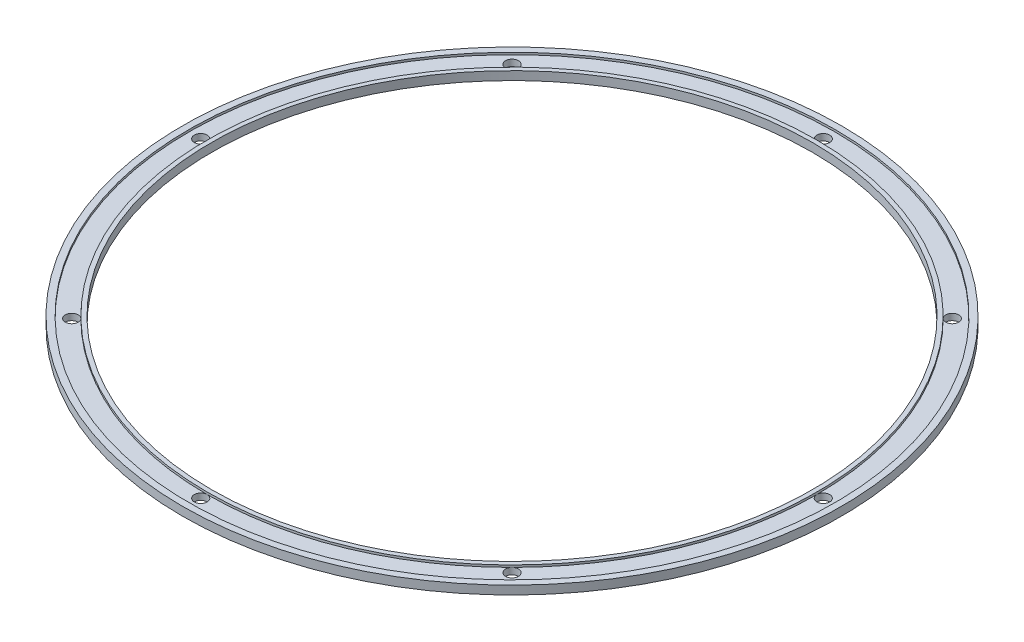
ISO-10303-21;
HEADER;
FILE_DESCRIPTION(('STEP AP214'),'2;1');
FILE_NAME('part.step','',(''),(''),'','','');
FILE_SCHEMA(('AUTOMOTIVE_DESIGN { 1 0 10303 214 1 1 1 1 }'));
ENDSEC;
DATA;
#1=APPLICATION_CONTEXT('core data for automotive mechanical design processes');
#2=APPLICATION_PROTOCOL_DEFINITION('international standard','automotive_design',2000,#1);
#3=PRODUCT_CONTEXT('',#1,'mechanical');
#4=PRODUCT('Part','Part','',(#3));
#5=PRODUCT_RELATED_PRODUCT_CATEGORY('part','',(#4));
#6=PRODUCT_DEFINITION_FORMATION('','',#4);
#7=PRODUCT_DEFINITION_CONTEXT('part definition',#1,'design');
#8=PRODUCT_DEFINITION('design','',#6,#7);
#9=PRODUCT_DEFINITION_SHAPE('','',#8);
#10=(LENGTH_UNIT() NAMED_UNIT(*) SI_UNIT(.MILLI.,.METRE.));
#11=(NAMED_UNIT(*) PLANE_ANGLE_UNIT() SI_UNIT($,.RADIAN.));
#12=(NAMED_UNIT(*) SI_UNIT($,.STERADIAN.) SOLID_ANGLE_UNIT());
#13=UNCERTAINTY_MEASURE_WITH_UNIT(LENGTH_MEASURE(1.E-05),#10,'distance_accuracy_value','');
#14=(GEOMETRIC_REPRESENTATION_CONTEXT(3) GLOBAL_UNCERTAINTY_ASSIGNED_CONTEXT((#13)) GLOBAL_UNIT_ASSIGNED_CONTEXT((#10,
#11,#12)) REPRESENTATION_CONTEXT('',''));
#15=CARTESIAN_POINT('',(0.,0.,0.));
#16=DIRECTION('',(0.,0.,1.));
#17=DIRECTION('',(1.,0.,0.));
#18=AXIS2_PLACEMENT_3D('',#15,#16,#17);
#19=CARTESIAN_POINT('',(0.,112.572086065125,0.));
#20=DIRECTION('',(0.,1.,0.));
#21=DIRECTION('',(0.,0.,-1.));
#22=AXIS2_PLACEMENT_3D('',#19,#20,#21);
#23=CYLINDRICAL_SURFACE('',#22,70.);
#24=CARTESIAN_POINT('',(0.,0.,0.));
#25=DIRECTION('',(0.,-1.,0.));
#26=DIRECTION('',(0.,0.,-1.));
#27=AXIS2_PLACEMENT_3D('',#24,#25,#26);
#28=CIRCLE('',#27,70.);
#29=CARTESIAN_POINT('',(0.,0.,-70.));
#30=VERTEX_POINT('',#29);
#31=EDGE_CURVE('E11',#30,#30,#28,.T.);
#32=ORIENTED_EDGE('',*,*,#31,.T.);
#33=EDGE_LOOP('',(#32));
#34=FACE_BOUND('',#33,.T.);
#35=CARTESIAN_POINT('',(0.,2.,0.));
#36=DIRECTION('',(0.,-1.,0.));
#37=DIRECTION('',(0.,0.,-1.));
#38=AXIS2_PLACEMENT_3D('',#35,#36,#37);
#39=CIRCLE('',#38,70.);
#40=CARTESIAN_POINT('',(0.,2.,-70.));
#41=VERTEX_POINT('',#40);
#42=EDGE_CURVE('E109',#41,#41,#39,.T.);
#43=ORIENTED_EDGE('',*,*,#42,.F.);
#44=EDGE_LOOP('',(#43));
#45=FACE_BOUND('',#44,.T.);
#46=ADVANCED_FACE('F34',(#34,#45),#23,.F.);
#47=CARTESIAN_POINT('',(70.,0.,0.));
#48=DIRECTION('',(0.,1.,0.));
#49=DIRECTION('',(0.,0.,-1.));
#50=AXIS2_PLACEMENT_3D('',#47,#48,#49);
#51=PLANE('',#50);
#52=CARTESIAN_POINT('',(0.,0.,72.5));
#53=DIRECTION('',(0.,-1.,0.));
#54=DIRECTION('',(0.,0.,-1.));
#55=AXIS2_PLACEMENT_3D('',#52,#53,#54);
#56=CIRCLE('',#55,1.5);
#57=CARTESIAN_POINT('',(0.,0.,71.));
#58=VERTEX_POINT('',#57);
#59=EDGE_CURVE('E113',#58,#58,#56,.T.);
#60=ORIENTED_EDGE('',*,*,#59,.F.);
#61=EDGE_LOOP('',(#60));
#62=FACE_BOUND('',#61,.T.);
#63=CARTESIAN_POINT('',(51.2652416360247,0.,51.2652416360247));
#64=DIRECTION('',(0.,-1.,0.));
#65=DIRECTION('',(0.,0.,-1.));
#66=AXIS2_PLACEMENT_3D('',#63,#64,#65);
#67=CIRCLE('',#66,1.50000000000001);
#68=CARTESIAN_POINT('',(51.2652416360247,0.,49.7652416360247));
#69=VERTEX_POINT('',#68);
#70=EDGE_CURVE('E298',#69,#69,#67,.T.);
#71=ORIENTED_EDGE('',*,*,#70,.F.);
#72=EDGE_LOOP('',(#71));
#73=FACE_BOUND('',#72,.T.);
#74=CARTESIAN_POINT('',(72.5,0.,0.));
#75=DIRECTION('',(0.,-1.,0.));
#76=DIRECTION('',(0.,0.,-1.));
#77=AXIS2_PLACEMENT_3D('',#74,#75,#76);
#78=CIRCLE('',#77,1.5);
#79=CARTESIAN_POINT('',(72.5,0.,-1.49999999999999));
#80=VERTEX_POINT('',#79);
#81=EDGE_CURVE('E326',#80,#80,#78,.T.);
#82=ORIENTED_EDGE('',*,*,#81,.F.);
#83=EDGE_LOOP('',(#82));
#84=FACE_BOUND('',#83,.T.);
#85=CARTESIAN_POINT('',(51.2652416360247,0.,-51.2652416360247));
#86=DIRECTION('',(0.,-1.,0.));
#87=DIRECTION('',(0.,0.,-1.));
#88=AXIS2_PLACEMENT_3D('',#85,#86,#87);
#89=CIRCLE('',#88,1.50000000000001);
#90=CARTESIAN_POINT('',(51.2652416360247,0.,-52.7652416360247));
#91=VERTEX_POINT('',#90);
#92=EDGE_CURVE('E321',#91,#91,#89,.T.);
#93=ORIENTED_EDGE('',*,*,#92,.F.);
#94=EDGE_LOOP('',(#93));
#95=FACE_BOUND('',#94,.T.);
#96=CARTESIAN_POINT('',(0.,0.,-72.5));
#97=DIRECTION('',(0.,-1.,0.));
#98=DIRECTION('',(0.,0.,-1.));
#99=AXIS2_PLACEMENT_3D('',#96,#97,#98);
#100=CIRCLE('',#99,1.5);
#101=CARTESIAN_POINT('',(0.,0.,-74.));
#102=VERTEX_POINT('',#101);
#103=EDGE_CURVE('E86',#102,#102,#100,.T.);
#104=ORIENTED_EDGE('',*,*,#103,.F.);
#105=EDGE_LOOP('',(#104));
#106=FACE_BOUND('',#105,.T.);
#107=CARTESIAN_POINT('',(-51.2652416360247,0.,-51.2652416360247));
#108=DIRECTION('',(0.,-1.,0.));
#109=DIRECTION('',(0.,0.,-1.));
#110=AXIS2_PLACEMENT_3D('',#107,#108,#109);
#111=CIRCLE('',#110,1.5);
#112=CARTESIAN_POINT('',(-51.2652416360247,0.,-52.7652416360247));
#113=VERTEX_POINT('',#112);
#114=EDGE_CURVE('E87',#113,#113,#111,.T.);
#115=ORIENTED_EDGE('',*,*,#114,.F.);
#116=EDGE_LOOP('',(#115));
#117=FACE_BOUND('',#116,.T.);
#118=CARTESIAN_POINT('',(-72.5,0.,0.));
#119=DIRECTION('',(0.,-1.,0.));
#120=DIRECTION('',(0.,0.,-1.));
#121=AXIS2_PLACEMENT_3D('',#118,#119,#120);
#122=CIRCLE('',#121,1.5);
#123=CARTESIAN_POINT('',(-72.5,0.,-1.50000000000001));
#124=VERTEX_POINT('',#123);
#125=EDGE_CURVE('E98',#124,#124,#122,.T.);
#126=ORIENTED_EDGE('',*,*,#125,.F.);
#127=EDGE_LOOP('',(#126));
#128=FACE_BOUND('',#127,.T.);
#129=CARTESIAN_POINT('',(-51.2652416360247,0.,51.2652416360247));
#130=DIRECTION('',(0.,-1.,0.));
#131=DIRECTION('',(0.,0.,-1.));
#132=AXIS2_PLACEMENT_3D('',#129,#130,#131);
#133=CIRCLE('',#132,1.50000000000001);
#134=CARTESIAN_POINT('',(-51.2652416360247,0.,49.7652416360247));
#135=VERTEX_POINT('',#134);
#136=EDGE_CURVE('E103',#135,#135,#133,.T.);
#137=ORIENTED_EDGE('',*,*,#136,.F.);
#138=EDGE_LOOP('',(#137));
#139=FACE_BOUND('',#138,.T.);
#140=CARTESIAN_POINT('',(0.,0.,0.));
#141=DIRECTION('',(0.,-1.,0.));
#142=DIRECTION('',(0.,0.,-1.));
#143=AXIS2_PLACEMENT_3D('',#140,#141,#142);
#144=CIRCLE('',#143,76.75);
#145=CARTESIAN_POINT('',(0.,0.,-76.75));
#146=VERTEX_POINT('',#145);
#147=EDGE_CURVE('E41',#146,#146,#144,.T.);
#148=ORIENTED_EDGE('',*,*,#147,.T.);
#149=EDGE_LOOP('',(#148));
#150=FACE_BOUND('',#149,.T.);
#151=ORIENTED_EDGE('',*,*,#31,.F.);
#152=EDGE_LOOP('',(#151));
#153=FACE_BOUND('',#152,.T.);
#154=ADVANCED_FACE('F126',(#62,#73,#84,#95,#106,#117,#128,#139,#150,#153),#51,.F.);
#155=CARTESIAN_POINT('',(0.,112.572086065125,0.));
#156=DIRECTION('',(0.,1.,0.));
#157=DIRECTION('',(0.,0.,-1.));
#158=AXIS2_PLACEMENT_3D('',#155,#156,#157);
#159=CYLINDRICAL_SURFACE('',#158,76.75);
#160=CARTESIAN_POINT('',(0.,2.,0.));
#161=DIRECTION('',(0.,-1.,0.));
#162=DIRECTION('',(0.,0.,-1.));
#163=AXIS2_PLACEMENT_3D('',#160,#161,#162);
#164=CIRCLE('',#163,76.75);
#165=CARTESIAN_POINT('',(0.,2.,-76.75));
#166=VERTEX_POINT('',#165);
#167=EDGE_CURVE('E121',#166,#166,#164,.T.);
#168=ORIENTED_EDGE('',*,*,#167,.T.);
#169=EDGE_LOOP('',(#168));
#170=FACE_BOUND('',#169,.T.);
#171=ORIENTED_EDGE('',*,*,#147,.F.);
#172=EDGE_LOOP('',(#171));
#173=FACE_BOUND('',#172,.T.);
#174=ADVANCED_FACE('F129',(#170,#173),#159,.T.);
#175=CARTESIAN_POINT('',(76.75,2.,0.));
#176=DIRECTION('',(0.,-1.,0.));
#177=DIRECTION('',(0.,0.,1.));
#178=AXIS2_PLACEMENT_3D('',#175,#176,#177);
#179=PLANE('',#178);
#180=CARTESIAN_POINT('',(0.,2.,0.));
#181=DIRECTION('',(0.,-1.,0.));
#182=DIRECTION('',(0.,0.,-1.));
#183=AXIS2_PLACEMENT_3D('',#180,#181,#182);
#184=CIRCLE('',#183,75.25);
#185=CARTESIAN_POINT('',(0.,2.,-75.25));
#186=VERTEX_POINT('',#185);
#187=EDGE_CURVE('E118',#186,#186,#184,.T.);
#188=ORIENTED_EDGE('',*,*,#187,.T.);
#189=EDGE_LOOP('',(#188));
#190=FACE_BOUND('',#189,.T.);
#191=ORIENTED_EDGE('',*,*,#167,.F.);
#192=EDGE_LOOP('',(#191));
#193=FACE_BOUND('',#192,.T.);
#194=ADVANCED_FACE('F131',(#190,#193),#179,.F.);
#195=CARTESIAN_POINT('',(0.,112.572086065125,0.));
#196=DIRECTION('',(0.,1.,0.));
#197=DIRECTION('',(0.,0.,-1.));
#198=AXIS2_PLACEMENT_3D('',#195,#196,#197);
#199=CYLINDRICAL_SURFACE('',#198,75.25);
#200=CARTESIAN_POINT('',(0.,1.5,0.));
#201=DIRECTION('',(0.,-1.,0.));
#202=DIRECTION('',(0.,0.,-1.));
#203=AXIS2_PLACEMENT_3D('',#200,#201,#202);
#204=CIRCLE('',#203,75.25);
#205=CARTESIAN_POINT('',(0.,1.5,-75.25));
#206=VERTEX_POINT('',#205);
#207=EDGE_CURVE('E78',#206,#206,#204,.T.);
#208=ORIENTED_EDGE('',*,*,#207,.T.);
#209=EDGE_LOOP('',(#208));
#210=FACE_BOUND('',#209,.T.);
#211=ORIENTED_EDGE('',*,*,#187,.F.);
#212=EDGE_LOOP('',(#211));
#213=FACE_BOUND('',#212,.T.);
#214=ADVANCED_FACE('F138',(#210,#213),#199,.F.);
#215=CARTESIAN_POINT('',(75.25,1.5,0.));
#216=DIRECTION('',(0.,-1.,0.));
#217=DIRECTION('',(0.,0.,1.));
#218=AXIS2_PLACEMENT_3D('',#215,#216,#217);
#219=PLANE('',#218);
#220=CARTESIAN_POINT('',(0.,1.5,0.));
#221=DIRECTION('',(0.,-1.,0.));
#222=DIRECTION('',(0.,0.,-1.));
#223=AXIS2_PLACEMENT_3D('',#220,#221,#222);
#224=CIRCLE('',#223,71.);
#225=CARTESIAN_POINT('',(0.,1.5,71.));
#226=VERTEX_POINT('',#225);
#227=CARTESIAN_POINT('',(-50.2045814642449,1.5,50.2045814642449));
#228=VERTEX_POINT('',#227);
#229=EDGE_CURVE('E307',#226,#228,#224,.T.);
#230=ORIENTED_EDGE('',*,*,#229,.T.);
#231=CARTESIAN_POINT('',(-51.2652416360247,1.5,51.2652416360247));
#232=DIRECTION('',(0.,-1.,0.));
#233=DIRECTION('',(0.,0.,-1.));
#234=AXIS2_PLACEMENT_3D('',#231,#232,#233);
#235=CIRCLE('',#234,1.50000000000001);
#236=EDGE_CURVE('E106',#228,#228,#235,.T.);
#237=ORIENTED_EDGE('',*,*,#236,.T.);
#238=CARTESIAN_POINT('',(-71.,1.5,0.));
#239=VERTEX_POINT('',#238);
#240=EDGE_CURVE('E309',#228,#239,#224,.T.);
#241=ORIENTED_EDGE('',*,*,#240,.T.);
#242=CARTESIAN_POINT('',(-72.5,1.5,0.));
#243=DIRECTION('',(0.,-1.,0.));
#244=DIRECTION('',(0.,0.,-1.));
#245=AXIS2_PLACEMENT_3D('',#242,#243,#244);
#246=CIRCLE('',#245,1.5);
#247=EDGE_CURVE('E101',#239,#239,#246,.T.);
#248=ORIENTED_EDGE('',*,*,#247,.T.);
#249=CARTESIAN_POINT('',(-50.2045814642449,1.5,-50.2045814642449));
#250=VERTEX_POINT('',#249);
#251=EDGE_CURVE('E53',#239,#250,#224,.T.);
#252=ORIENTED_EDGE('',*,*,#251,.T.);
#253=CARTESIAN_POINT('',(-51.2652416360247,1.5,-51.2652416360247));
#254=DIRECTION('',(0.,-1.,0.));
#255=DIRECTION('',(0.,0.,-1.));
#256=AXIS2_PLACEMENT_3D('',#253,#254,#255);
#257=CIRCLE('',#256,1.5);
#258=EDGE_CURVE('E93',#250,#250,#257,.T.);
#259=ORIENTED_EDGE('',*,*,#258,.T.);
#260=CARTESIAN_POINT('',(0.,1.5,-71.));
#261=VERTEX_POINT('',#260);
#262=EDGE_CURVE('E48',#250,#261,#224,.T.);
#263=ORIENTED_EDGE('',*,*,#262,.T.);
#264=CARTESIAN_POINT('',(0.,1.5,-72.5));
#265=DIRECTION('',(0.,-1.,0.));
#266=DIRECTION('',(0.,0.,-1.));
#267=AXIS2_PLACEMENT_3D('',#264,#265,#266);
#268=CIRCLE('',#267,1.5);
#269=EDGE_CURVE('E81',#261,#261,#268,.T.);
#270=ORIENTED_EDGE('',*,*,#269,.T.);
#271=CARTESIAN_POINT('',(50.2045814642449,1.5,-50.2045814642449));
#272=VERTEX_POINT('',#271);
#273=EDGE_CURVE('E71',#261,#272,#224,.T.);
#274=ORIENTED_EDGE('',*,*,#273,.T.);
#275=CARTESIAN_POINT('',(51.2652416360247,1.5,-51.2652416360247));
#276=DIRECTION('',(0.,-1.,0.));
#277=DIRECTION('',(0.,0.,-1.));
#278=AXIS2_PLACEMENT_3D('',#275,#276,#277);
#279=CIRCLE('',#278,1.50000000000001);
#280=EDGE_CURVE('E90',#272,#272,#279,.T.);
#281=ORIENTED_EDGE('',*,*,#280,.T.);
#282=CARTESIAN_POINT('',(71.,1.5,0.));
#283=VERTEX_POINT('',#282);
#284=EDGE_CURVE('E75',#272,#283,#224,.T.);
#285=ORIENTED_EDGE('',*,*,#284,.T.);
#286=CARTESIAN_POINT('',(72.5,1.5,0.));
#287=DIRECTION('',(0.,-1.,0.));
#288=DIRECTION('',(0.,0.,-1.));
#289=AXIS2_PLACEMENT_3D('',#286,#287,#288);
#290=CIRCLE('',#289,1.5);
#291=EDGE_CURVE('E318',#283,#283,#290,.T.);
#292=ORIENTED_EDGE('',*,*,#291,.T.);
#293=CARTESIAN_POINT('',(50.2045814642449,1.5,50.2045814642449));
#294=VERTEX_POINT('',#293);
#295=EDGE_CURVE('E306',#283,#294,#224,.T.);
#296=ORIENTED_EDGE('',*,*,#295,.T.);
#297=CARTESIAN_POINT('',(51.2652416360247,1.5,51.2652416360247));
#298=DIRECTION('',(0.,-1.,0.));
#299=DIRECTION('',(0.,0.,-1.));
#300=AXIS2_PLACEMENT_3D('',#297,#298,#299);
#301=CIRCLE('',#300,1.50000000000001);
#302=EDGE_CURVE('E305',#294,#294,#301,.T.);
#303=ORIENTED_EDGE('',*,*,#302,.T.);
#304=EDGE_CURVE('E301',#294,#226,#224,.T.);
#305=ORIENTED_EDGE('',*,*,#304,.T.);
#306=CARTESIAN_POINT('',(0.,1.5,72.5));
#307=DIRECTION('',(0.,-1.,0.));
#308=DIRECTION('',(0.,0.,-1.));
#309=AXIS2_PLACEMENT_3D('',#306,#307,#308);
#310=CIRCLE('',#309,1.5);
#311=EDGE_CURVE('E296',#226,#226,#310,.T.);
#312=ORIENTED_EDGE('',*,*,#311,.T.);
#313=EDGE_LOOP('',(#230,#237,#241,#248,#252,#259,#263,#270,#274,#281,#285,#292,#296,#303,#305,#312));
#314=FACE_BOUND('',#313,.T.);
#315=ORIENTED_EDGE('',*,*,#207,.F.);
#316=EDGE_LOOP('',(#315));
#317=FACE_BOUND('',#316,.T.);
#318=ADVANCED_FACE('F83',(#314,#317),#219,.F.);
#319=CARTESIAN_POINT('',(0.,112.572086065125,0.));
#320=DIRECTION('',(0.,1.,0.));
#321=DIRECTION('',(0.,0.,-1.));
#322=AXIS2_PLACEMENT_3D('',#319,#320,#321);
#323=CYLINDRICAL_SURFACE('',#322,71.);
#324=CARTESIAN_POINT('',(0.,2.,0.));
#325=DIRECTION('',(0.,-1.,0.));
#326=DIRECTION('',(0.,0.,-1.));
#327=AXIS2_PLACEMENT_3D('',#324,#325,#326);
#328=CIRCLE('',#327,71.);
#329=CARTESIAN_POINT('',(0.,2.,-71.));
#330=VERTEX_POINT('',#329);
#331=EDGE_CURVE('E112',#330,#330,#328,.T.);
#332=ORIENTED_EDGE('',*,*,#331,.T.);
#333=EDGE_LOOP('',(#332));
#334=FACE_BOUND('',#333,.T.);
#335=ORIENTED_EDGE('',*,*,#273,.F.);
#336=ORIENTED_EDGE('',*,*,#262,.F.);
#337=ORIENTED_EDGE('',*,*,#251,.F.);
#338=ORIENTED_EDGE('',*,*,#240,.F.);
#339=ORIENTED_EDGE('',*,*,#229,.F.);
#340=ORIENTED_EDGE('',*,*,#304,.F.);
#341=ORIENTED_EDGE('',*,*,#295,.F.);
#342=ORIENTED_EDGE('',*,*,#284,.F.);
#343=EDGE_LOOP('',(#335,#336,#337,#338,#339,#340,#341,#342));
#344=FACE_BOUND('',#343,.T.);
#345=ADVANCED_FACE('F73',(#334,#344),#323,.T.);
#346=CARTESIAN_POINT('',(71.,2.,0.));
#347=DIRECTION('',(0.,-1.,0.));
#348=DIRECTION('',(0.,0.,1.));
#349=AXIS2_PLACEMENT_3D('',#346,#347,#348);
#350=PLANE('',#349);
#351=ORIENTED_EDGE('',*,*,#42,.T.);
#352=EDGE_LOOP('',(#351));
#353=FACE_BOUND('',#352,.T.);
#354=ORIENTED_EDGE('',*,*,#331,.F.);
#355=EDGE_LOOP('',(#354));
#356=FACE_BOUND('',#355,.T.);
#357=ADVANCED_FACE('F150',(#353,#356),#350,.F.);
#358=CARTESIAN_POINT('',(-51.2652416360247,0.,51.2652416360247));
#359=DIRECTION('',(0.,1.,0.));
#360=DIRECTION('',(0.,0.,-1.));
#361=AXIS2_PLACEMENT_3D('',#358,#359,#360);
#362=CYLINDRICAL_SURFACE('',#361,1.50000000000001);
#363=ORIENTED_EDGE('',*,*,#136,.T.);
#364=EDGE_LOOP('',(#363));
#365=FACE_BOUND('',#364,.T.);
#366=ORIENTED_EDGE('',*,*,#236,.F.);
#367=EDGE_LOOP('',(#366));
#368=FACE_BOUND('',#367,.T.);
#369=ADVANCED_FACE('F153',(#365,#368),#362,.F.);
#370=CARTESIAN_POINT('',(-72.5,0.,0.));
#371=DIRECTION('',(0.,1.,0.));
#372=DIRECTION('',(0.,0.,-1.));
#373=AXIS2_PLACEMENT_3D('',#370,#371,#372);
#374=CYLINDRICAL_SURFACE('',#373,1.5);
#375=ORIENTED_EDGE('',*,*,#125,.T.);
#376=EDGE_LOOP('',(#375));
#377=FACE_BOUND('',#376,.T.);
#378=ORIENTED_EDGE('',*,*,#247,.F.);
#379=EDGE_LOOP('',(#378));
#380=FACE_BOUND('',#379,.T.);
#381=ADVANCED_FACE('F192',(#377,#380),#374,.F.);
#382=CARTESIAN_POINT('',(-51.2652416360247,0.,-51.2652416360247));
#383=DIRECTION('',(0.,1.,0.));
#384=DIRECTION('',(0.,0.,-1.));
#385=AXIS2_PLACEMENT_3D('',#382,#383,#384);
#386=CYLINDRICAL_SURFACE('',#385,1.5);
#387=ORIENTED_EDGE('',*,*,#114,.T.);
#388=EDGE_LOOP('',(#387));
#389=FACE_BOUND('',#388,.T.);
#390=ORIENTED_EDGE('',*,*,#258,.F.);
#391=EDGE_LOOP('',(#390));
#392=FACE_BOUND('',#391,.T.);
#393=ADVANCED_FACE('F202',(#389,#392),#386,.F.);
#394=CARTESIAN_POINT('',(0.,0.,-72.5));
#395=DIRECTION('',(0.,1.,0.));
#396=DIRECTION('',(0.,0.,-1.));
#397=AXIS2_PLACEMENT_3D('',#394,#395,#396);
#398=CYLINDRICAL_SURFACE('',#397,1.5);
#399=ORIENTED_EDGE('',*,*,#103,.T.);
#400=EDGE_LOOP('',(#399));
#401=FACE_BOUND('',#400,.T.);
#402=ORIENTED_EDGE('',*,*,#269,.F.);
#403=EDGE_LOOP('',(#402));
#404=FACE_BOUND('',#403,.T.);
#405=ADVANCED_FACE('F212',(#401,#404),#398,.F.);
#406=CARTESIAN_POINT('',(51.2652416360247,0.,-51.2652416360247));
#407=DIRECTION('',(0.,1.,0.));
#408=DIRECTION('',(0.,0.,-1.));
#409=AXIS2_PLACEMENT_3D('',#406,#407,#408);
#410=CYLINDRICAL_SURFACE('',#409,1.50000000000001);
#411=ORIENTED_EDGE('',*,*,#92,.T.);
#412=EDGE_LOOP('',(#411));
#413=FACE_BOUND('',#412,.T.);
#414=ORIENTED_EDGE('',*,*,#280,.F.);
#415=EDGE_LOOP('',(#414));
#416=FACE_BOUND('',#415,.T.);
#417=ADVANCED_FACE('F222',(#413,#416),#410,.F.);
#418=CARTESIAN_POINT('',(72.5,0.,0.));
#419=DIRECTION('',(0.,1.,0.));
#420=DIRECTION('',(0.,0.,-1.));
#421=AXIS2_PLACEMENT_3D('',#418,#419,#420);
#422=CYLINDRICAL_SURFACE('',#421,1.5);
#423=ORIENTED_EDGE('',*,*,#81,.T.);
#424=EDGE_LOOP('',(#423));
#425=FACE_BOUND('',#424,.T.);
#426=ORIENTED_EDGE('',*,*,#291,.F.);
#427=EDGE_LOOP('',(#426));
#428=FACE_BOUND('',#427,.T.);
#429=ADVANCED_FACE('F232',(#425,#428),#422,.F.);
#430=CARTESIAN_POINT('',(51.2652416360247,0.,51.2652416360247));
#431=DIRECTION('',(0.,1.,0.));
#432=DIRECTION('',(0.,0.,-1.));
#433=AXIS2_PLACEMENT_3D('',#430,#431,#432);
#434=CYLINDRICAL_SURFACE('',#433,1.50000000000001);
#435=ORIENTED_EDGE('',*,*,#70,.T.);
#436=EDGE_LOOP('',(#435));
#437=FACE_BOUND('',#436,.T.);
#438=ORIENTED_EDGE('',*,*,#302,.F.);
#439=EDGE_LOOP('',(#438));
#440=FACE_BOUND('',#439,.T.);
#441=ADVANCED_FACE('F242',(#437,#440),#434,.F.);
#442=CARTESIAN_POINT('',(0.,0.,72.5));
#443=DIRECTION('',(0.,1.,0.));
#444=DIRECTION('',(0.,0.,-1.));
#445=AXIS2_PLACEMENT_3D('',#442,#443,#444);
#446=CYLINDRICAL_SURFACE('',#445,1.5);
#447=ORIENTED_EDGE('',*,*,#59,.T.);
#448=EDGE_LOOP('',(#447));
#449=FACE_BOUND('',#448,.T.);
#450=ORIENTED_EDGE('',*,*,#311,.F.);
#451=EDGE_LOOP('',(#450));
#452=FACE_BOUND('',#451,.T.);
#453=ADVANCED_FACE('F252',(#449,#452),#446,.F.);
#454=CLOSED_SHELL('',(#46,#154,#174,#194,#214,#318,#345,#357,#369,#381,#393,#405,#417,#429,#441,#453));
#455=MANIFOLD_SOLID_BREP('B2',#454);
#456=ADVANCED_BREP_SHAPE_REPRESENTATION('',(#18,#455),#14);
#457=SHAPE_DEFINITION_REPRESENTATION(#9,#456);
ENDSEC;
END-ISO-10303-21;
